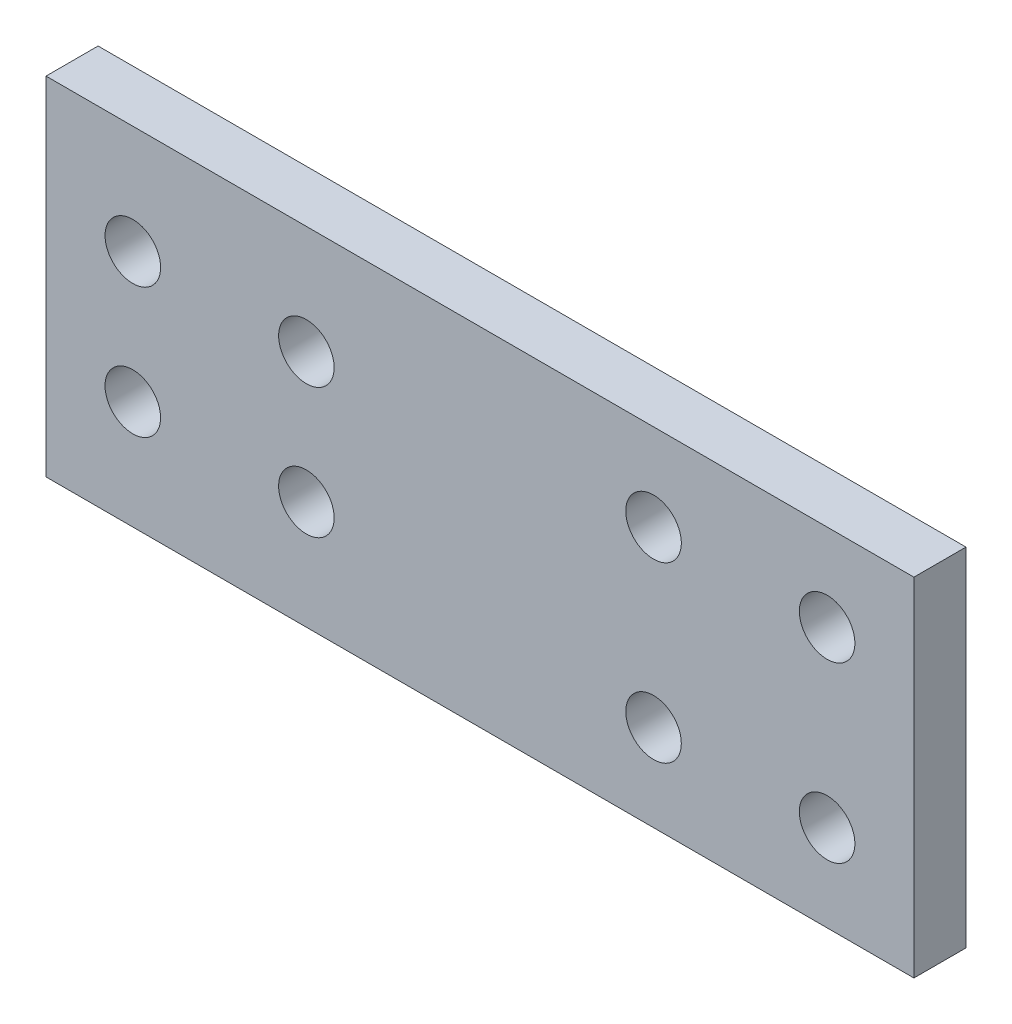
ISO-10303-21;
HEADER;
FILE_DESCRIPTION(('STEP AP214'),'2;1');
FILE_NAME('part.step','',(''),(''),'','','');
FILE_SCHEMA(('AUTOMOTIVE_DESIGN { 1 0 10303 214 1 1 1 1 }'));
ENDSEC;
DATA;
#1=APPLICATION_CONTEXT('core data for automotive mechanical design processes');
#2=APPLICATION_PROTOCOL_DEFINITION('international standard','automotive_design',2000,#1);
#3=PRODUCT_CONTEXT('',#1,'mechanical');
#4=PRODUCT('Part','Part','',(#3));
#5=PRODUCT_RELATED_PRODUCT_CATEGORY('part','',(#4));
#6=PRODUCT_DEFINITION_FORMATION('','',#4);
#7=PRODUCT_DEFINITION_CONTEXT('part definition',#1,'design');
#8=PRODUCT_DEFINITION('design','',#6,#7);
#9=PRODUCT_DEFINITION_SHAPE('','',#8);
#10=(LENGTH_UNIT() NAMED_UNIT(*) SI_UNIT(.MILLI.,.METRE.));
#11=(NAMED_UNIT(*) PLANE_ANGLE_UNIT() SI_UNIT($,.RADIAN.));
#12=(NAMED_UNIT(*) SI_UNIT($,.STERADIAN.) SOLID_ANGLE_UNIT());
#13=UNCERTAINTY_MEASURE_WITH_UNIT(LENGTH_MEASURE(1.E-05),#10,'distance_accuracy_value','');
#14=(GEOMETRIC_REPRESENTATION_CONTEXT(3) GLOBAL_UNCERTAINTY_ASSIGNED_CONTEXT((#13)) GLOBAL_UNIT_ASSIGNED_CONTEXT((#10,
#11,#12)) REPRESENTATION_CONTEXT('',''));
#15=CARTESIAN_POINT('',(0.,0.,0.));
#16=DIRECTION('',(0.,0.,1.));
#17=DIRECTION('',(1.,0.,0.));
#18=AXIS2_PLACEMENT_3D('',#15,#16,#17);
#19=CARTESIAN_POINT('',(0.,0.,3.));
#20=DIRECTION('',(0.,0.,1.));
#21=DIRECTION('',(1.,0.,0.));
#22=AXIS2_PLACEMENT_3D('',#19,#20,#21);
#23=PLANE('',#22);
#24=CARTESIAN_POINT('',(15.,-13.75,3.));
#25=DIRECTION('',(0.,0.,1.));
#26=DIRECTION('',(1.,0.,0.));
#27=AXIS2_PLACEMENT_3D('',#24,#25,#26);
#28=CIRCLE('',#27,1.6);
#29=CARTESIAN_POINT('',(16.6,-13.75,3.));
#30=VERTEX_POINT('',#29);
#31=EDGE_CURVE('E178',#30,#30,#28,.T.);
#32=ORIENTED_EDGE('',*,*,#31,.F.);
#33=EDGE_LOOP('',(#32));
#34=FACE_BOUND('',#33,.T.);
#35=CARTESIAN_POINT('',(5.,-6.25000000000001,3.));
#36=DIRECTION('',(0.,0.,1.));
#37=DIRECTION('',(1.,0.,0.));
#38=AXIS2_PLACEMENT_3D('',#35,#36,#37);
#39=CIRCLE('',#38,1.6);
#40=CARTESIAN_POINT('',(6.60000000000001,-6.25000000000001,3.));
#41=VERTEX_POINT('',#40);
#42=EDGE_CURVE('E162',#41,#41,#39,.T.);
#43=ORIENTED_EDGE('',*,*,#42,.F.);
#44=EDGE_LOOP('',(#43));
#45=FACE_BOUND('',#44,.T.);
#46=CARTESIAN_POINT('',(35.,-15.,3.));
#47=DIRECTION('',(0.,0.,1.));
#48=DIRECTION('',(1.,0.,0.));
#49=AXIS2_PLACEMENT_3D('',#46,#47,#48);
#50=CIRCLE('',#49,1.6);
#51=CARTESIAN_POINT('',(36.6,-15.,3.));
#52=VERTEX_POINT('',#51);
#53=EDGE_CURVE('E146',#52,#52,#50,.T.);
#54=ORIENTED_EDGE('',*,*,#53,.F.);
#55=EDGE_LOOP('',(#54));
#56=FACE_BOUND('',#55,.T.);
#57=CARTESIAN_POINT('',(45.,-5.00000000000001,3.));
#58=DIRECTION('',(0.,0.,1.));
#59=DIRECTION('',(1.,0.,0.));
#60=AXIS2_PLACEMENT_3D('',#57,#58,#59);
#61=CIRCLE('',#60,1.6);
#62=CARTESIAN_POINT('',(46.6,-5.00000000000001,3.));
#63=VERTEX_POINT('',#62);
#64=EDGE_CURVE('E116',#63,#63,#61,.T.);
#65=ORIENTED_EDGE('',*,*,#64,.F.);
#66=EDGE_LOOP('',(#65));
#67=FACE_BOUND('',#66,.T.);
#68=DIRECTION('',(0.,-1.,0.));
#69=VECTOR('',#68,1.);
#70=CARTESIAN_POINT('',(0.,0.,3.));
#71=LINE('',#70,#69);
#72=CARTESIAN_POINT('',(0.,0.,3.));
#73=VERTEX_POINT('',#72);
#74=CARTESIAN_POINT('',(0.,-20.,3.));
#75=VERTEX_POINT('',#74);
#76=EDGE_CURVE('E96',#73,#75,#71,.T.);
#77=ORIENTED_EDGE('',*,*,#76,.T.);
#78=DIRECTION('',(1.,0.,0.));
#79=VECTOR('',#78,1.);
#80=CARTESIAN_POINT('',(0.,-20.,3.));
#81=LINE('',#80,#79);
#82=CARTESIAN_POINT('',(50.,-20.,3.));
#83=VERTEX_POINT('',#82);
#84=EDGE_CURVE('E91',#75,#83,#81,.T.);
#85=ORIENTED_EDGE('',*,*,#84,.T.);
#86=DIRECTION('',(0.,1.,0.));
#87=VECTOR('',#86,1.);
#88=CARTESIAN_POINT('',(50.,0.,3.));
#89=LINE('',#88,#87);
#90=CARTESIAN_POINT('',(50.,0.,3.));
#91=VERTEX_POINT('',#90);
#92=EDGE_CURVE('E94',#83,#91,#89,.T.);
#93=ORIENTED_EDGE('',*,*,#92,.T.);
#94=DIRECTION('',(-1.,0.,0.));
#95=VECTOR('',#94,1.);
#96=CARTESIAN_POINT('',(0.,0.,3.));
#97=LINE('',#96,#95);
#98=EDGE_CURVE('E61',#91,#73,#97,.T.);
#99=ORIENTED_EDGE('',*,*,#98,.T.);
#100=EDGE_LOOP('',(#77,#85,#93,#99));
#101=FACE_BOUND('',#100,.T.);
#102=CARTESIAN_POINT('',(45.,-15.,3.));
#103=DIRECTION('',(0.,0.,1.));
#104=DIRECTION('',(-1.,0.,0.));
#105=AXIS2_PLACEMENT_3D('',#102,#103,#104);
#106=CIRCLE('',#105,1.6);
#107=CARTESIAN_POINT('',(43.4,-15.,3.));
#108=VERTEX_POINT('',#107);
#109=EDGE_CURVE('E138',#108,#108,#106,.T.);
#110=ORIENTED_EDGE('',*,*,#109,.F.);
#111=EDGE_LOOP('',(#110));
#112=FACE_BOUND('',#111,.T.);
#113=CARTESIAN_POINT('',(35.,-5.00000000000001,3.));
#114=DIRECTION('',(0.,0.,1.));
#115=DIRECTION('',(-1.,0.,0.));
#116=AXIS2_PLACEMENT_3D('',#113,#114,#115);
#117=CIRCLE('',#116,1.6);
#118=CARTESIAN_POINT('',(33.4,-5.00000000000001,3.));
#119=VERTEX_POINT('',#118);
#120=EDGE_CURVE('E154',#119,#119,#117,.T.);
#121=ORIENTED_EDGE('',*,*,#120,.F.);
#122=EDGE_LOOP('',(#121));
#123=FACE_BOUND('',#122,.T.);
#124=CARTESIAN_POINT('',(5.,-13.75,3.));
#125=DIRECTION('',(0.,0.,1.));
#126=DIRECTION('',(-1.,0.,0.));
#127=AXIS2_PLACEMENT_3D('',#124,#125,#126);
#128=CIRCLE('',#127,1.6);
#129=CARTESIAN_POINT('',(3.4,-13.75,3.));
#130=VERTEX_POINT('',#129);
#131=EDGE_CURVE('E170',#130,#130,#128,.T.);
#132=ORIENTED_EDGE('',*,*,#131,.F.);
#133=EDGE_LOOP('',(#132));
#134=FACE_BOUND('',#133,.T.);
#135=CARTESIAN_POINT('',(15.,-6.25000000000001,3.));
#136=DIRECTION('',(0.,0.,1.));
#137=DIRECTION('',(-1.,0.,0.));
#138=AXIS2_PLACEMENT_3D('',#135,#136,#137);
#139=CIRCLE('',#138,1.6);
#140=CARTESIAN_POINT('',(13.4,-6.25000000000001,3.));
#141=VERTEX_POINT('',#140);
#142=EDGE_CURVE('E186',#141,#141,#139,.T.);
#143=ORIENTED_EDGE('',*,*,#142,.F.);
#144=EDGE_LOOP('',(#143));
#145=FACE_BOUND('',#144,.T.);
#146=ADVANCED_FACE('F43',(#34,#45,#56,#67,#101,#112,#123,#134,#145),#23,.T.);
#147=CARTESIAN_POINT('',(0.,0.,0.));
#148=DIRECTION('',(0.,0.,1.));
#149=DIRECTION('',(1.,0.,0.));
#150=AXIS2_PLACEMENT_3D('',#147,#148,#149);
#151=PLANE('',#150);
#152=DIRECTION('',(0.,-1.,0.));
#153=VECTOR('',#152,1.);
#154=CARTESIAN_POINT('',(0.,0.,0.));
#155=LINE('',#154,#153);
#156=CARTESIAN_POINT('',(0.,0.,0.));
#157=VERTEX_POINT('',#156);
#158=CARTESIAN_POINT('',(0.,-20.,0.));
#159=VERTEX_POINT('',#158);
#160=EDGE_CURVE('E112',#157,#159,#155,.T.);
#161=ORIENTED_EDGE('',*,*,#160,.F.);
#162=DIRECTION('',(-1.,0.,0.));
#163=VECTOR('',#162,1.);
#164=CARTESIAN_POINT('',(0.,0.,0.));
#165=LINE('',#164,#163);
#166=CARTESIAN_POINT('',(50.,0.,0.));
#167=VERTEX_POINT('',#166);
#168=EDGE_CURVE('E84',#167,#157,#165,.T.);
#169=ORIENTED_EDGE('',*,*,#168,.F.);
#170=DIRECTION('',(0.,1.,0.));
#171=VECTOR('',#170,1.);
#172=CARTESIAN_POINT('',(50.,0.,0.));
#173=LINE('',#172,#171);
#174=CARTESIAN_POINT('',(50.,-20.,0.));
#175=VERTEX_POINT('',#174);
#176=EDGE_CURVE('E78',#175,#167,#173,.T.);
#177=ORIENTED_EDGE('',*,*,#176,.F.);
#178=DIRECTION('',(1.,0.,0.));
#179=VECTOR('',#178,1.);
#180=CARTESIAN_POINT('',(0.,-20.,0.));
#181=LINE('',#180,#179);
#182=EDGE_CURVE('E101',#159,#175,#181,.T.);
#183=ORIENTED_EDGE('',*,*,#182,.F.);
#184=EDGE_LOOP('',(#161,#169,#177,#183));
#185=FACE_BOUND('',#184,.T.);
#186=CARTESIAN_POINT('',(45.,-5.00000000000001,0.));
#187=DIRECTION('',(0.,0.,1.));
#188=DIRECTION('',(1.,0.,0.));
#189=AXIS2_PLACEMENT_3D('',#186,#187,#188);
#190=CIRCLE('',#189,1.6);
#191=CARTESIAN_POINT('',(46.6,-5.00000000000001,0.));
#192=VERTEX_POINT('',#191);
#193=EDGE_CURVE('E134',#192,#192,#190,.T.);
#194=ORIENTED_EDGE('',*,*,#193,.T.);
#195=EDGE_LOOP('',(#194));
#196=FACE_BOUND('',#195,.T.);
#197=CARTESIAN_POINT('',(45.,-15.,0.));
#198=DIRECTION('',(0.,0.,1.));
#199=DIRECTION('',(-1.,0.,0.));
#200=AXIS2_PLACEMENT_3D('',#197,#198,#199);
#201=CIRCLE('',#200,1.6);
#202=CARTESIAN_POINT('',(43.4,-15.,0.));
#203=VERTEX_POINT('',#202);
#204=EDGE_CURVE('E142',#203,#203,#201,.T.);
#205=ORIENTED_EDGE('',*,*,#204,.T.);
#206=EDGE_LOOP('',(#205));
#207=FACE_BOUND('',#206,.T.);
#208=CARTESIAN_POINT('',(35.,-15.,0.));
#209=DIRECTION('',(0.,0.,1.));
#210=DIRECTION('',(1.,0.,0.));
#211=AXIS2_PLACEMENT_3D('',#208,#209,#210);
#212=CIRCLE('',#211,1.6);
#213=CARTESIAN_POINT('',(36.6,-15.,0.));
#214=VERTEX_POINT('',#213);
#215=EDGE_CURVE('E150',#214,#214,#212,.T.);
#216=ORIENTED_EDGE('',*,*,#215,.T.);
#217=EDGE_LOOP('',(#216));
#218=FACE_BOUND('',#217,.T.);
#219=CARTESIAN_POINT('',(35.,-5.00000000000001,0.));
#220=DIRECTION('',(0.,0.,1.));
#221=DIRECTION('',(-1.,0.,0.));
#222=AXIS2_PLACEMENT_3D('',#219,#220,#221);
#223=CIRCLE('',#222,1.6);
#224=CARTESIAN_POINT('',(33.4,-5.00000000000001,0.));
#225=VERTEX_POINT('',#224);
#226=EDGE_CURVE('E158',#225,#225,#223,.T.);
#227=ORIENTED_EDGE('',*,*,#226,.T.);
#228=EDGE_LOOP('',(#227));
#229=FACE_BOUND('',#228,.T.);
#230=CARTESIAN_POINT('',(5.,-6.25000000000001,0.));
#231=DIRECTION('',(0.,0.,1.));
#232=DIRECTION('',(1.,0.,0.));
#233=AXIS2_PLACEMENT_3D('',#230,#231,#232);
#234=CIRCLE('',#233,1.6);
#235=CARTESIAN_POINT('',(6.60000000000001,-6.25000000000001,0.));
#236=VERTEX_POINT('',#235);
#237=EDGE_CURVE('E166',#236,#236,#234,.T.);
#238=ORIENTED_EDGE('',*,*,#237,.T.);
#239=EDGE_LOOP('',(#238));
#240=FACE_BOUND('',#239,.T.);
#241=CARTESIAN_POINT('',(5.,-13.75,0.));
#242=DIRECTION('',(0.,0.,1.));
#243=DIRECTION('',(-1.,0.,0.));
#244=AXIS2_PLACEMENT_3D('',#241,#242,#243);
#245=CIRCLE('',#244,1.6);
#246=CARTESIAN_POINT('',(3.4,-13.75,0.));
#247=VERTEX_POINT('',#246);
#248=EDGE_CURVE('E174',#247,#247,#245,.T.);
#249=ORIENTED_EDGE('',*,*,#248,.T.);
#250=EDGE_LOOP('',(#249));
#251=FACE_BOUND('',#250,.T.);
#252=CARTESIAN_POINT('',(15.,-13.75,0.));
#253=DIRECTION('',(0.,0.,1.));
#254=DIRECTION('',(1.,0.,0.));
#255=AXIS2_PLACEMENT_3D('',#252,#253,#254);
#256=CIRCLE('',#255,1.6);
#257=CARTESIAN_POINT('',(16.6,-13.75,0.));
#258=VERTEX_POINT('',#257);
#259=EDGE_CURVE('E182',#258,#258,#256,.T.);
#260=ORIENTED_EDGE('',*,*,#259,.T.);
#261=EDGE_LOOP('',(#260));
#262=FACE_BOUND('',#261,.T.);
#263=CARTESIAN_POINT('',(15.,-6.25000000000001,0.));
#264=DIRECTION('',(0.,0.,1.));
#265=DIRECTION('',(-1.,0.,0.));
#266=AXIS2_PLACEMENT_3D('',#263,#264,#265);
#267=CIRCLE('',#266,1.6);
#268=CARTESIAN_POINT('',(13.4,-6.25000000000001,0.));
#269=VERTEX_POINT('',#268);
#270=EDGE_CURVE('E190',#269,#269,#267,.T.);
#271=ORIENTED_EDGE('',*,*,#270,.T.);
#272=EDGE_LOOP('',(#271));
#273=FACE_BOUND('',#272,.T.);
#274=ADVANCED_FACE('F129',(#185,#196,#207,#218,#229,#240,#251,#262,#273),#151,.F.);
#275=CARTESIAN_POINT('',(0.,0.,3.));
#276=DIRECTION('',(1.,0.,0.));
#277=DIRECTION('',(0.,0.,-1.));
#278=AXIS2_PLACEMENT_3D('',#275,#276,#277);
#279=PLANE('',#278);
#280=ORIENTED_EDGE('',*,*,#160,.T.);
#281=DIRECTION('',(0.,0.,-1.));
#282=VECTOR('',#281,1.);
#283=CARTESIAN_POINT('',(0.,-20.,3.));
#284=LINE('',#283,#282);
#285=EDGE_CURVE('E11',#75,#159,#284,.T.);
#286=ORIENTED_EDGE('',*,*,#285,.F.);
#287=ORIENTED_EDGE('',*,*,#76,.F.);
#288=DIRECTION('',(0.,0.,-1.));
#289=VECTOR('',#288,1.);
#290=CARTESIAN_POINT('',(0.,0.,3.));
#291=LINE('',#290,#289);
#292=EDGE_CURVE('E108',#73,#157,#291,.T.);
#293=ORIENTED_EDGE('',*,*,#292,.T.);
#294=EDGE_LOOP('',(#280,#286,#287,#293));
#295=FACE_BOUND('',#294,.T.);
#296=ADVANCED_FACE('F45',(#295),#279,.F.);
#297=CARTESIAN_POINT('',(0.,-20.,3.));
#298=DIRECTION('',(0.,1.,0.));
#299=DIRECTION('',(-1.,0.,0.));
#300=AXIS2_PLACEMENT_3D('',#297,#298,#299);
#301=PLANE('',#300);
#302=ORIENTED_EDGE('',*,*,#182,.T.);
#303=DIRECTION('',(0.,0.,-1.));
#304=VECTOR('',#303,1.);
#305=CARTESIAN_POINT('',(50.,-20.,3.));
#306=LINE('',#305,#304);
#307=EDGE_CURVE('E53',#83,#175,#306,.T.);
#308=ORIENTED_EDGE('',*,*,#307,.F.);
#309=ORIENTED_EDGE('',*,*,#84,.F.);
#310=ORIENTED_EDGE('',*,*,#285,.T.);
#311=EDGE_LOOP('',(#302,#308,#309,#310));
#312=FACE_BOUND('',#311,.T.);
#313=ADVANCED_FACE('F100',(#312),#301,.F.);
#314=CARTESIAN_POINT('',(50.,0.,3.));
#315=DIRECTION('',(-1.,0.,0.));
#316=DIRECTION('',(0.,0.,1.));
#317=AXIS2_PLACEMENT_3D('',#314,#315,#316);
#318=PLANE('',#317);
#319=ORIENTED_EDGE('',*,*,#176,.T.);
#320=DIRECTION('',(0.,0.,-1.));
#321=VECTOR('',#320,1.);
#322=CARTESIAN_POINT('',(50.,0.,3.));
#323=LINE('',#322,#321);
#324=EDGE_CURVE('E103',#91,#167,#323,.T.);
#325=ORIENTED_EDGE('',*,*,#324,.F.);
#326=ORIENTED_EDGE('',*,*,#92,.F.);
#327=ORIENTED_EDGE('',*,*,#307,.T.);
#328=EDGE_LOOP('',(#319,#325,#326,#327));
#329=FACE_BOUND('',#328,.T.);
#330=ADVANCED_FACE('F104',(#329),#318,.F.);
#331=CARTESIAN_POINT('',(0.,0.,3.));
#332=DIRECTION('',(0.,-1.,0.));
#333=DIRECTION('',(1.,0.,0.));
#334=AXIS2_PLACEMENT_3D('',#331,#332,#333);
#335=PLANE('',#334);
#336=ORIENTED_EDGE('',*,*,#168,.T.);
#337=ORIENTED_EDGE('',*,*,#292,.F.);
#338=ORIENTED_EDGE('',*,*,#98,.F.);
#339=ORIENTED_EDGE('',*,*,#324,.T.);
#340=EDGE_LOOP('',(#336,#337,#338,#339));
#341=FACE_BOUND('',#340,.T.);
#342=ADVANCED_FACE('F126',(#341),#335,.F.);
#343=CARTESIAN_POINT('',(45.,-5.00000000000001,3.));
#344=DIRECTION('',(0.,0.,-1.));
#345=DIRECTION('',(-1.,0.,0.));
#346=AXIS2_PLACEMENT_3D('',#343,#344,#345);
#347=CYLINDRICAL_SURFACE('',#346,1.6);
#348=ORIENTED_EDGE('',*,*,#64,.T.);
#349=EDGE_LOOP('',(#348));
#350=FACE_BOUND('',#349,.T.);
#351=ORIENTED_EDGE('',*,*,#193,.F.);
#352=EDGE_LOOP('',(#351));
#353=FACE_BOUND('',#352,.T.);
#354=ADVANCED_FACE('F211',(#350,#353),#347,.F.);
#355=CARTESIAN_POINT('',(45.,-15.,3.));
#356=DIRECTION('',(0.,0.,-1.));
#357=DIRECTION('',(-1.,0.,0.));
#358=AXIS2_PLACEMENT_3D('',#355,#356,#357);
#359=CYLINDRICAL_SURFACE('',#358,1.6);
#360=ORIENTED_EDGE('',*,*,#109,.T.);
#361=EDGE_LOOP('',(#360));
#362=FACE_BOUND('',#361,.T.);
#363=ORIENTED_EDGE('',*,*,#204,.F.);
#364=EDGE_LOOP('',(#363));
#365=FACE_BOUND('',#364,.T.);
#366=ADVANCED_FACE('F265',(#362,#365),#359,.F.);
#367=CARTESIAN_POINT('',(35.,-15.,3.));
#368=DIRECTION('',(0.,0.,-1.));
#369=DIRECTION('',(-1.,0.,0.));
#370=AXIS2_PLACEMENT_3D('',#367,#368,#369);
#371=CYLINDRICAL_SURFACE('',#370,1.6);
#372=ORIENTED_EDGE('',*,*,#53,.T.);
#373=EDGE_LOOP('',(#372));
#374=FACE_BOUND('',#373,.T.);
#375=ORIENTED_EDGE('',*,*,#215,.F.);
#376=EDGE_LOOP('',(#375));
#377=FACE_BOUND('',#376,.T.);
#378=ADVANCED_FACE('F274',(#374,#377),#371,.F.);
#379=CARTESIAN_POINT('',(35.,-5.00000000000001,3.));
#380=DIRECTION('',(0.,0.,-1.));
#381=DIRECTION('',(-1.,0.,0.));
#382=AXIS2_PLACEMENT_3D('',#379,#380,#381);
#383=CYLINDRICAL_SURFACE('',#382,1.6);
#384=ORIENTED_EDGE('',*,*,#120,.T.);
#385=EDGE_LOOP('',(#384));
#386=FACE_BOUND('',#385,.T.);
#387=ORIENTED_EDGE('',*,*,#226,.F.);
#388=EDGE_LOOP('',(#387));
#389=FACE_BOUND('',#388,.T.);
#390=ADVANCED_FACE('F283',(#386,#389),#383,.F.);
#391=CARTESIAN_POINT('',(5.,-6.25000000000001,3.));
#392=DIRECTION('',(0.,0.,-1.));
#393=DIRECTION('',(-1.,0.,0.));
#394=AXIS2_PLACEMENT_3D('',#391,#392,#393);
#395=CYLINDRICAL_SURFACE('',#394,1.6);
#396=ORIENTED_EDGE('',*,*,#42,.T.);
#397=EDGE_LOOP('',(#396));
#398=FACE_BOUND('',#397,.T.);
#399=ORIENTED_EDGE('',*,*,#237,.F.);
#400=EDGE_LOOP('',(#399));
#401=FACE_BOUND('',#400,.T.);
#402=ADVANCED_FACE('F293',(#398,#401),#395,.F.);
#403=CARTESIAN_POINT('',(5.,-13.75,3.));
#404=DIRECTION('',(0.,0.,-1.));
#405=DIRECTION('',(-1.,0.,0.));
#406=AXIS2_PLACEMENT_3D('',#403,#404,#405);
#407=CYLINDRICAL_SURFACE('',#406,1.6);
#408=ORIENTED_EDGE('',*,*,#131,.T.);
#409=EDGE_LOOP('',(#408));
#410=FACE_BOUND('',#409,.T.);
#411=ORIENTED_EDGE('',*,*,#248,.F.);
#412=EDGE_LOOP('',(#411));
#413=FACE_BOUND('',#412,.T.);
#414=ADVANCED_FACE('F303',(#410,#413),#407,.F.);
#415=CARTESIAN_POINT('',(15.,-13.75,3.));
#416=DIRECTION('',(0.,0.,-1.));
#417=DIRECTION('',(-1.,0.,0.));
#418=AXIS2_PLACEMENT_3D('',#415,#416,#417);
#419=CYLINDRICAL_SURFACE('',#418,1.6);
#420=ORIENTED_EDGE('',*,*,#31,.T.);
#421=EDGE_LOOP('',(#420));
#422=FACE_BOUND('',#421,.T.);
#423=ORIENTED_EDGE('',*,*,#259,.F.);
#424=EDGE_LOOP('',(#423));
#425=FACE_BOUND('',#424,.T.);
#426=ADVANCED_FACE('F313',(#422,#425),#419,.F.);
#427=CARTESIAN_POINT('',(15.,-6.25000000000001,3.));
#428=DIRECTION('',(0.,0.,-1.));
#429=DIRECTION('',(-1.,0.,0.));
#430=AXIS2_PLACEMENT_3D('',#427,#428,#429);
#431=CYLINDRICAL_SURFACE('',#430,1.6);
#432=ORIENTED_EDGE('',*,*,#142,.T.);
#433=EDGE_LOOP('',(#432));
#434=FACE_BOUND('',#433,.T.);
#435=ORIENTED_EDGE('',*,*,#270,.F.);
#436=EDGE_LOOP('',(#435));
#437=FACE_BOUND('',#436,.T.);
#438=ADVANCED_FACE('F198',(#434,#437),#431,.F.);
#439=CLOSED_SHELL('',(#146,#274,#296,#313,#330,#342,#354,#366,#378,#390,#402,#414,#426,#438));
#440=MANIFOLD_SOLID_BREP('B2',#439);
#441=ADVANCED_BREP_SHAPE_REPRESENTATION('',(#18,#440),#14);
#442=SHAPE_DEFINITION_REPRESENTATION(#9,#441);
ENDSEC;
END-ISO-10303-21;
